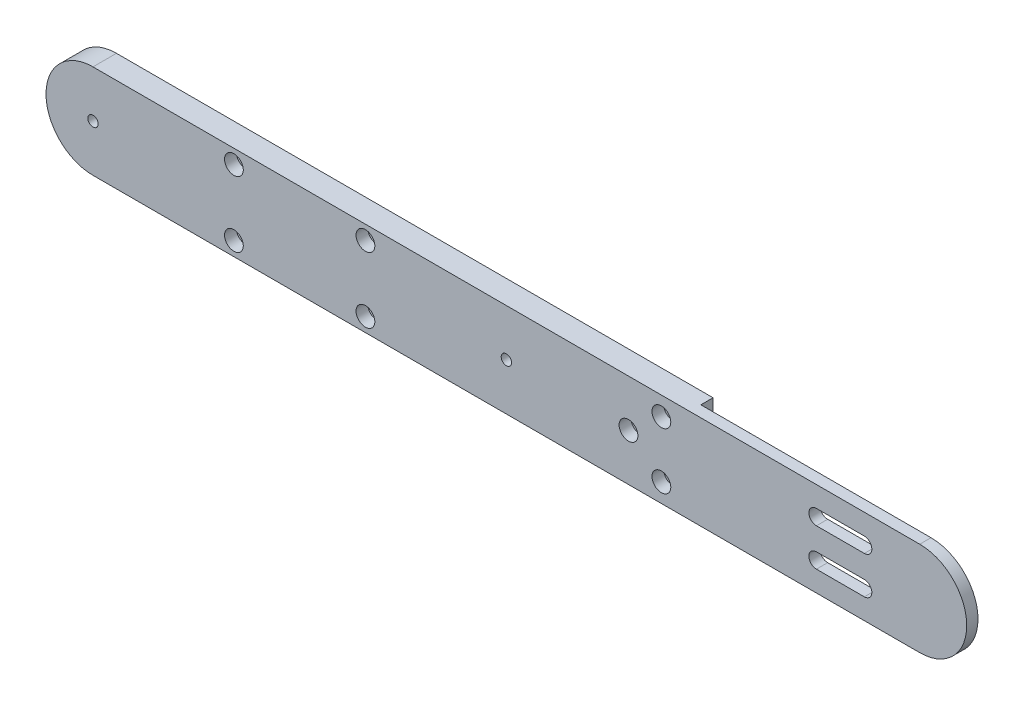
ISO-10303-21;
HEADER;
FILE_DESCRIPTION(('STEP AP214'),'2;1');
FILE_NAME('part.step','',(''),(''),'','','');
FILE_SCHEMA(('AUTOMOTIVE_DESIGN { 1 0 10303 214 1 1 1 1 }'));
ENDSEC;
DATA;
#1=APPLICATION_CONTEXT('core data for automotive mechanical design processes');
#2=APPLICATION_PROTOCOL_DEFINITION('international standard','automotive_design',2000,#1);
#3=PRODUCT_CONTEXT('',#1,'mechanical');
#4=PRODUCT('Part','Part','',(#3));
#5=PRODUCT_RELATED_PRODUCT_CATEGORY('part','',(#4));
#6=PRODUCT_DEFINITION_FORMATION('','',#4);
#7=PRODUCT_DEFINITION_CONTEXT('part definition',#1,'design');
#8=PRODUCT_DEFINITION('design','',#6,#7);
#9=PRODUCT_DEFINITION_SHAPE('','',#8);
#10=(LENGTH_UNIT() NAMED_UNIT(*) SI_UNIT(.MILLI.,.METRE.));
#11=(NAMED_UNIT(*) PLANE_ANGLE_UNIT() SI_UNIT($,.RADIAN.));
#12=(NAMED_UNIT(*) SI_UNIT($,.STERADIAN.) SOLID_ANGLE_UNIT());
#13=UNCERTAINTY_MEASURE_WITH_UNIT(LENGTH_MEASURE(1.E-05),#10,'distance_accuracy_value','');
#14=(GEOMETRIC_REPRESENTATION_CONTEXT(3) GLOBAL_UNCERTAINTY_ASSIGNED_CONTEXT((#13)) GLOBAL_UNIT_ASSIGNED_CONTEXT((#10,
#11,#12)) REPRESENTATION_CONTEXT('',''));
#15=CARTESIAN_POINT('',(0.,0.,0.));
#16=DIRECTION('',(0.,0.,1.));
#17=DIRECTION('',(1.,0.,0.));
#18=AXIS2_PLACEMENT_3D('',#15,#16,#17);
#19=CARTESIAN_POINT('',(121.,6.,5.));
#20=DIRECTION('',(0.,0.,-1.));
#21=DIRECTION('',(-1.,0.,0.));
#22=AXIS2_PLACEMENT_3D('',#19,#20,#21);
#23=CYLINDRICAL_SURFACE('',#22,1.25);
#24=CARTESIAN_POINT('',(121.,6.,0.));
#25=DIRECTION('',(0.,0.,-1.));
#26=DIRECTION('',(-1.,0.,0.));
#27=AXIS2_PLACEMENT_3D('',#24,#25,#26);
#28=CIRCLE('',#27,1.25);
#29=CARTESIAN_POINT('',(119.75,6.,0.));
#30=VERTEX_POINT('',#29);
#31=EDGE_CURVE('E345',#30,#30,#28,.T.);
#32=ORIENTED_EDGE('',*,*,#31,.T.);
#33=EDGE_LOOP('',(#32));
#34=FACE_BOUND('',#33,.T.);
#35=CARTESIAN_POINT('',(121.,6.,2.5));
#36=DIRECTION('',(0.,0.,1.));
#37=DIRECTION('',(1.,0.,0.));
#38=AXIS2_PLACEMENT_3D('',#35,#36,#37);
#39=CIRCLE('',#38,1.25);
#40=CARTESIAN_POINT('',(122.25,6.,2.5));
#41=VERTEX_POINT('',#40);
#42=EDGE_CURVE('E361',#41,#41,#39,.F.);
#43=ORIENTED_EDGE('',*,*,#42,.F.);
#44=EDGE_LOOP('',(#43));
#45=FACE_BOUND('',#44,.T.);
#46=ADVANCED_FACE('F130',(#34,#45),#23,.F.);
#47=CARTESIAN_POINT('',(121.,-6.,5.));
#48=DIRECTION('',(0.,0.,-1.));
#49=DIRECTION('',(-1.,0.,0.));
#50=AXIS2_PLACEMENT_3D('',#47,#48,#49);
#51=CYLINDRICAL_SURFACE('',#50,1.25);
#52=CARTESIAN_POINT('',(121.,-6.,0.));
#53=DIRECTION('',(0.,0.,-1.));
#54=DIRECTION('',(-1.,0.,0.));
#55=AXIS2_PLACEMENT_3D('',#52,#53,#54);
#56=CIRCLE('',#55,1.25);
#57=CARTESIAN_POINT('',(119.75,-6.,0.));
#58=VERTEX_POINT('',#57);
#59=EDGE_CURVE('E342',#58,#58,#56,.T.);
#60=ORIENTED_EDGE('',*,*,#59,.T.);
#61=EDGE_LOOP('',(#60));
#62=FACE_BOUND('',#61,.T.);
#63=CARTESIAN_POINT('',(121.,-6.,2.5));
#64=DIRECTION('',(0.,0.,1.));
#65=DIRECTION('',(1.,0.,0.));
#66=AXIS2_PLACEMENT_3D('',#63,#64,#65);
#67=CIRCLE('',#66,1.25);
#68=CARTESIAN_POINT('',(122.25,-6.,2.5));
#69=VERTEX_POINT('',#68);
#70=EDGE_CURVE('E434',#69,#69,#67,.F.);
#71=ORIENTED_EDGE('',*,*,#70,.F.);
#72=EDGE_LOOP('',(#71));
#73=FACE_BOUND('',#72,.T.);
#74=ADVANCED_FACE('F469',(#62,#73),#51,.F.);
#75=CARTESIAN_POINT('',(114.,0.,5.));
#76=DIRECTION('',(0.,0.,-1.));
#77=DIRECTION('',(-1.,0.,0.));
#78=AXIS2_PLACEMENT_3D('',#75,#76,#77);
#79=CYLINDRICAL_SURFACE('',#78,1.25);
#80=CARTESIAN_POINT('',(114.,0.,0.));
#81=DIRECTION('',(0.,0.,-1.));
#82=DIRECTION('',(-1.,0.,0.));
#83=AXIS2_PLACEMENT_3D('',#80,#81,#82);
#84=CIRCLE('',#83,1.25);
#85=CARTESIAN_POINT('',(112.75,0.,0.));
#86=VERTEX_POINT('',#85);
#87=EDGE_CURVE('E346',#86,#86,#84,.T.);
#88=ORIENTED_EDGE('',*,*,#87,.T.);
#89=EDGE_LOOP('',(#88));
#90=FACE_BOUND('',#89,.T.);
#91=CARTESIAN_POINT('',(114.,0.,2.5));
#92=DIRECTION('',(0.,0.,1.));
#93=DIRECTION('',(1.,0.,0.));
#94=AXIS2_PLACEMENT_3D('',#91,#92,#93);
#95=CIRCLE('',#94,1.25);
#96=CARTESIAN_POINT('',(115.25,0.,2.5));
#97=VERTEX_POINT('',#96);
#98=EDGE_CURVE('E431',#97,#97,#95,.F.);
#99=ORIENTED_EDGE('',*,*,#98,.F.);
#100=EDGE_LOOP('',(#99));
#101=FACE_BOUND('',#100,.T.);
#102=ADVANCED_FACE('F476',(#90,#101),#79,.F.);
#103=CARTESIAN_POINT('',(58.,-7.,5.));
#104=DIRECTION('',(0.,0.,-1.));
#105=DIRECTION('',(-1.,0.,0.));
#106=AXIS2_PLACEMENT_3D('',#103,#104,#105);
#107=CYLINDRICAL_SURFACE('',#106,1.25);
#108=CARTESIAN_POINT('',(58.,-7.,0.));
#109=DIRECTION('',(0.,0.,-1.));
#110=DIRECTION('',(-1.,0.,0.));
#111=AXIS2_PLACEMENT_3D('',#108,#109,#110);
#112=CIRCLE('',#111,1.25);
#113=CARTESIAN_POINT('',(56.75,-7.,0.));
#114=VERTEX_POINT('',#113);
#115=EDGE_CURVE('E349',#114,#114,#112,.T.);
#116=ORIENTED_EDGE('',*,*,#115,.T.);
#117=EDGE_LOOP('',(#116));
#118=FACE_BOUND('',#117,.T.);
#119=CARTESIAN_POINT('',(58.,-7.,2.5));
#120=DIRECTION('',(0.,0.,1.));
#121=DIRECTION('',(1.,0.,0.));
#122=AXIS2_PLACEMENT_3D('',#119,#120,#121);
#123=CIRCLE('',#122,1.25);
#124=CARTESIAN_POINT('',(59.25,-7.,2.5));
#125=VERTEX_POINT('',#124);
#126=EDGE_CURVE('E428',#125,#125,#123,.F.);
#127=ORIENTED_EDGE('',*,*,#126,.F.);
#128=EDGE_LOOP('',(#127));
#129=FACE_BOUND('',#128,.T.);
#130=ADVANCED_FACE('F614',(#118,#129),#107,.F.);
#131=CARTESIAN_POINT('',(30.,-7.,5.));
#132=DIRECTION('',(0.,0.,-1.));
#133=DIRECTION('',(-1.,0.,0.));
#134=AXIS2_PLACEMENT_3D('',#131,#132,#133);
#135=CYLINDRICAL_SURFACE('',#134,1.25);
#136=CARTESIAN_POINT('',(30.,-7.,0.));
#137=DIRECTION('',(0.,0.,-1.));
#138=DIRECTION('',(-1.,0.,0.));
#139=AXIS2_PLACEMENT_3D('',#136,#137,#138);
#140=CIRCLE('',#139,1.25);
#141=CARTESIAN_POINT('',(28.75,-7.,0.));
#142=VERTEX_POINT('',#141);
#143=EDGE_CURVE('E352',#142,#142,#140,.T.);
#144=ORIENTED_EDGE('',*,*,#143,.T.);
#145=EDGE_LOOP('',(#144));
#146=FACE_BOUND('',#145,.T.);
#147=CARTESIAN_POINT('',(30.,-7.,2.5));
#148=DIRECTION('',(0.,0.,1.));
#149=DIRECTION('',(1.,0.,0.));
#150=AXIS2_PLACEMENT_3D('',#147,#148,#149);
#151=CIRCLE('',#150,1.25);
#152=CARTESIAN_POINT('',(31.25,-7.,2.5));
#153=VERTEX_POINT('',#152);
#154=EDGE_CURVE('E425',#153,#153,#151,.F.);
#155=ORIENTED_EDGE('',*,*,#154,.F.);
#156=EDGE_LOOP('',(#155));
#157=FACE_BOUND('',#156,.T.);
#158=ADVANCED_FACE('F618',(#146,#157),#135,.F.);
#159=CARTESIAN_POINT('',(30.,7.,5.));
#160=DIRECTION('',(0.,0.,-1.));
#161=DIRECTION('',(-1.,0.,0.));
#162=AXIS2_PLACEMENT_3D('',#159,#160,#161);
#163=CYLINDRICAL_SURFACE('',#162,1.25);
#164=CARTESIAN_POINT('',(30.,7.,0.));
#165=DIRECTION('',(0.,0.,-1.));
#166=DIRECTION('',(-1.,0.,0.));
#167=AXIS2_PLACEMENT_3D('',#164,#165,#166);
#168=CIRCLE('',#167,1.25);
#169=CARTESIAN_POINT('',(28.75,7.,0.));
#170=VERTEX_POINT('',#169);
#171=EDGE_CURVE('E355',#170,#170,#168,.T.);
#172=ORIENTED_EDGE('',*,*,#171,.T.);
#173=EDGE_LOOP('',(#172));
#174=FACE_BOUND('',#173,.T.);
#175=CARTESIAN_POINT('',(30.,7.,2.5));
#176=DIRECTION('',(0.,0.,1.));
#177=DIRECTION('',(1.,0.,0.));
#178=AXIS2_PLACEMENT_3D('',#175,#176,#177);
#179=CIRCLE('',#178,1.25);
#180=CARTESIAN_POINT('',(31.25,7.,2.5));
#181=VERTEX_POINT('',#180);
#182=EDGE_CURVE('E422',#181,#181,#179,.F.);
#183=ORIENTED_EDGE('',*,*,#182,.F.);
#184=EDGE_LOOP('',(#183));
#185=FACE_BOUND('',#184,.T.);
#186=ADVANCED_FACE('F621',(#174,#185),#163,.F.);
#187=CARTESIAN_POINT('',(58.,7.,5.));
#188=DIRECTION('',(0.,0.,-1.));
#189=DIRECTION('',(-1.,0.,0.));
#190=AXIS2_PLACEMENT_3D('',#187,#188,#189);
#191=CYLINDRICAL_SURFACE('',#190,1.25);
#192=CARTESIAN_POINT('',(58.,7.,0.));
#193=DIRECTION('',(0.,0.,-1.));
#194=DIRECTION('',(-1.,0.,0.));
#195=AXIS2_PLACEMENT_3D('',#192,#193,#194);
#196=CIRCLE('',#195,1.25);
#197=CARTESIAN_POINT('',(56.75,7.,0.));
#198=VERTEX_POINT('',#197);
#199=EDGE_CURVE('E358',#198,#198,#196,.T.);
#200=ORIENTED_EDGE('',*,*,#199,.T.);
#201=EDGE_LOOP('',(#200));
#202=FACE_BOUND('',#201,.T.);
#203=CARTESIAN_POINT('',(58.,7.,2.5));
#204=DIRECTION('',(0.,0.,1.));
#205=DIRECTION('',(1.,0.,0.));
#206=AXIS2_PLACEMENT_3D('',#203,#204,#205);
#207=CIRCLE('',#206,1.25);
#208=CARTESIAN_POINT('',(59.25,7.,2.5));
#209=VERTEX_POINT('',#208);
#210=EDGE_CURVE('E341',#209,#209,#207,.F.);
#211=ORIENTED_EDGE('',*,*,#210,.F.);
#212=EDGE_LOOP('',(#211));
#213=FACE_BOUND('',#212,.T.);
#214=ADVANCED_FACE('F482',(#202,#213),#191,.F.);
#215=CARTESIAN_POINT('',(0.,0.,5.));
#216=DIRECTION('',(0.,0.,-1.));
#217=DIRECTION('',(-1.,0.,0.));
#218=AXIS2_PLACEMENT_3D('',#215,#216,#217);
#219=CYLINDRICAL_SURFACE('',#218,10.);
#220=DIRECTION('',(0.,0.,-1.));
#221=VECTOR('',#220,1.);
#222=CARTESIAN_POINT('',(0.,10.,5.));
#223=LINE('',#222,#221);
#224=CARTESIAN_POINT('',(0.,10.,0.));
#225=VERTEX_POINT('',#224);
#226=CARTESIAN_POINT('',(0.,10.,5.));
#227=VERTEX_POINT('',#226);
#228=EDGE_CURVE('E394',#225,#227,#223,.F.);
#229=ORIENTED_EDGE('',*,*,#228,.F.);
#230=CARTESIAN_POINT('',(0.,0.,0.));
#231=DIRECTION('',(0.,0.,1.));
#232=DIRECTION('',(1.,0.,0.));
#233=AXIS2_PLACEMENT_3D('',#230,#231,#232);
#234=CIRCLE('',#233,10.);
#235=CARTESIAN_POINT('',(0.,-10.,0.));
#236=VERTEX_POINT('',#235);
#237=EDGE_CURVE('E389',#225,#236,#234,.T.);
#238=ORIENTED_EDGE('',*,*,#237,.T.);
#239=DIRECTION('',(0.,0.,-1.));
#240=VECTOR('',#239,1.);
#241=CARTESIAN_POINT('',(0.,-10.,5.));
#242=LINE('',#241,#240);
#243=CARTESIAN_POINT('',(0.,-10.,5.));
#244=VERTEX_POINT('',#243);
#245=EDGE_CURVE('E388',#244,#236,#242,.T.);
#246=ORIENTED_EDGE('',*,*,#245,.F.);
#247=CARTESIAN_POINT('',(0.,0.,5.));
#248=DIRECTION('',(0.,0.,1.));
#249=DIRECTION('',(1.,0.,0.));
#250=AXIS2_PLACEMENT_3D('',#247,#248,#249);
#251=CIRCLE('',#250,10.);
#252=EDGE_CURVE('E385',#227,#244,#251,.T.);
#253=ORIENTED_EDGE('',*,*,#252,.F.);
#254=EDGE_LOOP('',(#229,#238,#246,#253));
#255=FACE_BOUND('',#254,.T.);
#256=ADVANCED_FACE('F515',(#255),#219,.T.);
#257=CARTESIAN_POINT('',(0.,0.,0.));
#258=DIRECTION('',(0.,0.,1.));
#259=DIRECTION('',(1.,0.,0.));
#260=AXIS2_PLACEMENT_3D('',#257,#258,#259);
#261=PLANE('',#260);
#262=ORIENTED_EDGE('',*,*,#199,.F.);
#263=EDGE_LOOP('',(#262));
#264=FACE_BOUND('',#263,.T.);
#265=ORIENTED_EDGE('',*,*,#171,.F.);
#266=EDGE_LOOP('',(#265));
#267=FACE_BOUND('',#266,.T.);
#268=ORIENTED_EDGE('',*,*,#143,.F.);
#269=EDGE_LOOP('',(#268));
#270=FACE_BOUND('',#269,.T.);
#271=ORIENTED_EDGE('',*,*,#115,.F.);
#272=EDGE_LOOP('',(#271));
#273=FACE_BOUND('',#272,.T.);
#274=ORIENTED_EDGE('',*,*,#87,.F.);
#275=EDGE_LOOP('',(#274));
#276=FACE_BOUND('',#275,.T.);
#277=ORIENTED_EDGE('',*,*,#59,.F.);
#278=EDGE_LOOP('',(#277));
#279=FACE_BOUND('',#278,.T.);
#280=ORIENTED_EDGE('',*,*,#31,.F.);
#281=EDGE_LOOP('',(#280));
#282=FACE_BOUND('',#281,.T.);
#283=CARTESIAN_POINT('',(88.,0.,0.));
#284=DIRECTION('',(0.,0.,1.));
#285=DIRECTION('',(1.,0.,0.));
#286=AXIS2_PLACEMENT_3D('',#283,#284,#285);
#287=CIRCLE('',#286,2.54999999999999);
#288=CARTESIAN_POINT('',(90.55,0.,0.));
#289=VERTEX_POINT('',#288);
#290=EDGE_CURVE('E369',#289,#289,#287,.T.);
#291=ORIENTED_EDGE('',*,*,#290,.T.);
#292=EDGE_LOOP('',(#291));
#293=FACE_BOUND('',#292,.T.);
#294=CARTESIAN_POINT('',(0.,0.,0.));
#295=DIRECTION('',(0.,0.,1.));
#296=DIRECTION('',(1.,0.,0.));
#297=AXIS2_PLACEMENT_3D('',#294,#295,#296);
#298=CIRCLE('',#297,2.55);
#299=CARTESIAN_POINT('',(2.55,0.,0.));
#300=VERTEX_POINT('',#299);
#301=EDGE_CURVE('E372',#300,#300,#298,.T.);
#302=ORIENTED_EDGE('',*,*,#301,.T.);
#303=EDGE_LOOP('',(#302));
#304=FACE_BOUND('',#303,.T.);
#305=DIRECTION('',(1.,0.,0.));
#306=VECTOR('',#305,1.);
#307=CARTESIAN_POINT('',(0.,10.,0.));
#308=LINE('',#307,#306);
#309=CARTESIAN_POINT('',(127.,10.,0.));
#310=VERTEX_POINT('',#309);
#311=EDGE_CURVE('E401',#225,#310,#308,.T.);
#312=ORIENTED_EDGE('',*,*,#311,.T.);
#313=DIRECTION('',(0.,1.,0.));
#314=VECTOR('',#313,1.);
#315=CARTESIAN_POINT('',(127.,-10.,0.));
#316=LINE('',#315,#314);
#317=CARTESIAN_POINT('',(127.,-10.,0.));
#318=VERTEX_POINT('',#317);
#319=EDGE_CURVE('E294',#318,#310,#316,.T.);
#320=ORIENTED_EDGE('',*,*,#319,.F.);
#321=DIRECTION('',(1.,0.,0.));
#322=VECTOR('',#321,1.);
#323=CARTESIAN_POINT('',(0.,-10.,0.));
#324=LINE('',#323,#322);
#325=EDGE_CURVE('E405',#236,#318,#324,.T.);
#326=ORIENTED_EDGE('',*,*,#325,.F.);
#327=ORIENTED_EDGE('',*,*,#237,.F.);
#328=EDGE_LOOP('',(#312,#320,#326,#327));
#329=FACE_BOUND('',#328,.T.);
#330=ADVANCED_FACE('F511',(#264,#267,#270,#273,#276,#279,#282,#293,#304,#329),#261,.F.);
#331=CARTESIAN_POINT('',(0.,0.,5.));
#332=DIRECTION('',(0.,0.,1.));
#333=DIRECTION('',(1.,0.,0.));
#334=AXIS2_PLACEMENT_3D('',#331,#332,#333);
#335=PLANE('',#334);
#336=CARTESIAN_POINT('',(154.,-4.,5.));
#337=DIRECTION('',(0.,0.,1.));
#338=DIRECTION('',(1.,0.,0.));
#339=AXIS2_PLACEMENT_3D('',#336,#337,#338);
#340=CIRCLE('',#339,1.59999999999999);
#341=CARTESIAN_POINT('',(154.,-2.4,5.));
#342=VERTEX_POINT('',#341);
#343=CARTESIAN_POINT('',(154.,-5.6,5.));
#344=VERTEX_POINT('',#343);
#345=EDGE_CURVE('E241',#342,#344,#340,.T.);
#346=ORIENTED_EDGE('',*,*,#345,.F.);
#347=DIRECTION('',(-1.,0.,0.));
#348=VECTOR('',#347,1.);
#349=CARTESIAN_POINT('',(164.2,-2.4,5.));
#350=LINE('',#349,#348);
#351=CARTESIAN_POINT('',(164.2,-2.4,5.));
#352=VERTEX_POINT('',#351);
#353=EDGE_CURVE('E253',#352,#342,#350,.T.);
#354=ORIENTED_EDGE('',*,*,#353,.F.);
#355=CARTESIAN_POINT('',(164.2,-4.,5.));
#356=DIRECTION('',(0.,0.,1.));
#357=DIRECTION('',(1.,0.,0.));
#358=AXIS2_PLACEMENT_3D('',#355,#356,#357);
#359=CIRCLE('',#358,1.59999999999999);
#360=CARTESIAN_POINT('',(164.2,-5.59999999999999,5.));
#361=VERTEX_POINT('',#360);
#362=EDGE_CURVE('E247',#361,#352,#359,.T.);
#363=ORIENTED_EDGE('',*,*,#362,.F.);
#364=DIRECTION('',(-1.,0.,0.));
#365=VECTOR('',#364,1.);
#366=CARTESIAN_POINT('',(164.2,-5.6,5.));
#367=LINE('',#366,#365);
#368=EDGE_CURVE('E145',#361,#344,#367,.T.);
#369=ORIENTED_EDGE('',*,*,#368,.T.);
#370=EDGE_LOOP('',(#346,#354,#363,#369));
#371=FACE_BOUND('',#370,.T.);
#372=DIRECTION('',(-1.,0.,0.));
#373=VECTOR('',#372,1.);
#374=CARTESIAN_POINT('',(164.2,5.6,5.));
#375=LINE('',#374,#373);
#376=CARTESIAN_POINT('',(164.2,5.6,5.));
#377=VERTEX_POINT('',#376);
#378=CARTESIAN_POINT('',(154.,5.59999999999999,5.));
#379=VERTEX_POINT('',#378);
#380=EDGE_CURVE('E271',#377,#379,#375,.T.);
#381=ORIENTED_EDGE('',*,*,#380,.F.);
#382=CARTESIAN_POINT('',(164.2,4.,5.));
#383=DIRECTION('',(0.,0.,1.));
#384=DIRECTION('',(1.,0.,0.));
#385=AXIS2_PLACEMENT_3D('',#382,#383,#384);
#386=CIRCLE('',#385,1.59999999999999);
#387=CARTESIAN_POINT('',(164.2,2.4,5.));
#388=VERTEX_POINT('',#387);
#389=EDGE_CURVE('E263',#388,#377,#386,.T.);
#390=ORIENTED_EDGE('',*,*,#389,.F.);
#391=DIRECTION('',(-1.,0.,0.));
#392=VECTOR('',#391,1.);
#393=CARTESIAN_POINT('',(164.2,2.4,5.));
#394=LINE('',#393,#392);
#395=CARTESIAN_POINT('',(154.,2.4,5.));
#396=VERTEX_POINT('',#395);
#397=EDGE_CURVE('E266',#388,#396,#394,.T.);
#398=ORIENTED_EDGE('',*,*,#397,.T.);
#399=CARTESIAN_POINT('',(154.,4.,5.));
#400=DIRECTION('',(0.,0.,1.));
#401=DIRECTION('',(1.,0.,0.));
#402=AXIS2_PLACEMENT_3D('',#399,#400,#401);
#403=CIRCLE('',#402,1.59999999999999);
#404=EDGE_CURVE('E153',#379,#396,#403,.T.);
#405=ORIENTED_EDGE('',*,*,#404,.F.);
#406=EDGE_LOOP('',(#381,#390,#398,#405));
#407=FACE_BOUND('',#406,.T.);
#408=CARTESIAN_POINT('',(121.,-6.,5.));
#409=DIRECTION('',(0.,0.,1.));
#410=DIRECTION('',(1.,0.,0.));
#411=AXIS2_PLACEMENT_3D('',#408,#409,#410);
#412=CIRCLE('',#411,2.);
#413=CARTESIAN_POINT('',(123.,-6.,5.));
#414=VERTEX_POINT('',#413);
#415=EDGE_CURVE('E315',#414,#414,#412,.T.);
#416=ORIENTED_EDGE('',*,*,#415,.F.);
#417=EDGE_LOOP('',(#416));
#418=FACE_BOUND('',#417,.T.);
#419=CARTESIAN_POINT('',(114.,0.,5.));
#420=DIRECTION('',(0.,0.,1.));
#421=DIRECTION('',(1.,0.,0.));
#422=AXIS2_PLACEMENT_3D('',#419,#420,#421);
#423=CIRCLE('',#422,2.);
#424=CARTESIAN_POINT('',(116.,0.,5.));
#425=VERTEX_POINT('',#424);
#426=EDGE_CURVE('E316',#425,#425,#423,.T.);
#427=ORIENTED_EDGE('',*,*,#426,.F.);
#428=EDGE_LOOP('',(#427));
#429=FACE_BOUND('',#428,.T.);
#430=CARTESIAN_POINT('',(58.,7.,5.));
#431=DIRECTION('',(0.,0.,1.));
#432=DIRECTION('',(1.,0.,0.));
#433=AXIS2_PLACEMENT_3D('',#430,#431,#432);
#434=CIRCLE('',#433,2.);
#435=CARTESIAN_POINT('',(60.,7.,5.));
#436=VERTEX_POINT('',#435);
#437=EDGE_CURVE('E323',#436,#436,#434,.T.);
#438=ORIENTED_EDGE('',*,*,#437,.F.);
#439=EDGE_LOOP('',(#438));
#440=FACE_BOUND('',#439,.T.);
#441=CARTESIAN_POINT('',(30.,7.,5.));
#442=DIRECTION('',(0.,0.,1.));
#443=DIRECTION('',(1.,0.,0.));
#444=AXIS2_PLACEMENT_3D('',#441,#442,#443);
#445=CIRCLE('',#444,2.);
#446=CARTESIAN_POINT('',(32.,7.,5.));
#447=VERTEX_POINT('',#446);
#448=EDGE_CURVE('E329',#447,#447,#445,.T.);
#449=ORIENTED_EDGE('',*,*,#448,.F.);
#450=EDGE_LOOP('',(#449));
#451=FACE_BOUND('',#450,.T.);
#452=CARTESIAN_POINT('',(30.,-7.,5.));
#453=DIRECTION('',(0.,0.,1.));
#454=DIRECTION('',(1.,0.,0.));
#455=AXIS2_PLACEMENT_3D('',#452,#453,#454);
#456=CIRCLE('',#455,2.);
#457=CARTESIAN_POINT('',(32.,-7.,5.));
#458=VERTEX_POINT('',#457);
#459=EDGE_CURVE('E303',#458,#458,#456,.T.);
#460=ORIENTED_EDGE('',*,*,#459,.F.);
#461=EDGE_LOOP('',(#460));
#462=FACE_BOUND('',#461,.T.);
#463=CARTESIAN_POINT('',(58.,-7.,5.));
#464=DIRECTION('',(0.,0.,1.));
#465=DIRECTION('',(1.,0.,0.));
#466=AXIS2_PLACEMENT_3D('',#463,#464,#465);
#467=CIRCLE('',#466,2.);
#468=CARTESIAN_POINT('',(60.,-7.,5.));
#469=VERTEX_POINT('',#468);
#470=EDGE_CURVE('E304',#469,#469,#467,.T.);
#471=ORIENTED_EDGE('',*,*,#470,.F.);
#472=EDGE_LOOP('',(#471));
#473=FACE_BOUND('',#472,.T.);
#474=CARTESIAN_POINT('',(121.,6.,5.));
#475=DIRECTION('',(0.,0.,1.));
#476=DIRECTION('',(1.,0.,0.));
#477=AXIS2_PLACEMENT_3D('',#474,#475,#476);
#478=CIRCLE('',#477,2.);
#479=CARTESIAN_POINT('',(123.,6.,5.));
#480=VERTEX_POINT('',#479);
#481=EDGE_CURVE('E319',#480,#480,#478,.T.);
#482=ORIENTED_EDGE('',*,*,#481,.F.);
#483=EDGE_LOOP('',(#482));
#484=FACE_BOUND('',#483,.T.);
#485=CARTESIAN_POINT('',(0.,0.,5.));
#486=DIRECTION('',(0.,0.,1.));
#487=DIRECTION('',(1.,0.,0.));
#488=AXIS2_PLACEMENT_3D('',#485,#486,#487);
#489=CIRCLE('',#488,1.1);
#490=CARTESIAN_POINT('',(1.1,0.,5.));
#491=VERTEX_POINT('',#490);
#492=EDGE_CURVE('E377',#491,#491,#489,.T.);
#493=ORIENTED_EDGE('',*,*,#492,.F.);
#494=EDGE_LOOP('',(#493));
#495=FACE_BOUND('',#494,.T.);
#496=CARTESIAN_POINT('',(88.,0.,5.));
#497=DIRECTION('',(0.,0.,1.));
#498=DIRECTION('',(1.,0.,0.));
#499=AXIS2_PLACEMENT_3D('',#496,#497,#498);
#500=CIRCLE('',#499,1.09999999999999);
#501=CARTESIAN_POINT('',(89.1,0.,5.));
#502=VERTEX_POINT('',#501);
#503=EDGE_CURVE('E381',#502,#502,#500,.T.);
#504=ORIENTED_EDGE('',*,*,#503,.F.);
#505=EDGE_LOOP('',(#504));
#506=FACE_BOUND('',#505,.T.);
#507=ORIENTED_EDGE('',*,*,#252,.T.);
#508=DIRECTION('',(1.,0.,0.));
#509=VECTOR('',#508,1.);
#510=CARTESIAN_POINT('',(0.,-10.,5.));
#511=LINE('',#510,#509);
#512=CARTESIAN_POINT('',(176.,-10.,5.));
#513=VERTEX_POINT('',#512);
#514=EDGE_CURVE('E397',#244,#513,#511,.T.);
#515=ORIENTED_EDGE('',*,*,#514,.T.);
#516=CARTESIAN_POINT('',(176.,0.,5.));
#517=DIRECTION('',(0.,0.,1.));
#518=DIRECTION('',(1.,0.,0.));
#519=AXIS2_PLACEMENT_3D('',#516,#517,#518);
#520=CIRCLE('',#519,10.);
#521=CARTESIAN_POINT('',(176.,10.,5.));
#522=VERTEX_POINT('',#521);
#523=EDGE_CURVE('E380',#513,#522,#520,.T.);
#524=ORIENTED_EDGE('',*,*,#523,.T.);
#525=DIRECTION('',(1.,0.,0.));
#526=VECTOR('',#525,1.);
#527=CARTESIAN_POINT('',(0.,10.,5.));
#528=LINE('',#527,#526);
#529=EDGE_CURVE('E400',#227,#522,#528,.T.);
#530=ORIENTED_EDGE('',*,*,#529,.F.);
#531=EDGE_LOOP('',(#507,#515,#524,#530));
#532=FACE_BOUND('',#531,.T.);
#533=ADVANCED_FACE('F250',(#371,#407,#418,#429,#440,#451,#462,#473,#484,#495,#506,#532),#335,.T.);
#534=CARTESIAN_POINT('',(176.,0.,5.));
#535=DIRECTION('',(0.,0.,-1.));
#536=DIRECTION('',(-1.,0.,0.));
#537=AXIS2_PLACEMENT_3D('',#534,#535,#536);
#538=CYLINDRICAL_SURFACE('',#537,10.);
#539=CARTESIAN_POINT('',(176.,0.,2.6));
#540=DIRECTION('',(0.,0.,1.));
#541=DIRECTION('',(1.,0.,0.));
#542=AXIS2_PLACEMENT_3D('',#539,#540,#541);
#543=CIRCLE('',#542,10.);
#544=CARTESIAN_POINT('',(176.,-10.,2.6));
#545=VERTEX_POINT('',#544);
#546=CARTESIAN_POINT('',(176.,10.,2.6));
#547=VERTEX_POINT('',#546);
#548=EDGE_CURVE('E296',#545,#547,#543,.T.);
#549=ORIENTED_EDGE('',*,*,#548,.T.);
#550=DIRECTION('',(0.,0.,-1.));
#551=VECTOR('',#550,1.);
#552=CARTESIAN_POINT('',(176.,10.,5.));
#553=LINE('',#552,#551);
#554=EDGE_CURVE('E404',#522,#547,#553,.T.);
#555=ORIENTED_EDGE('',*,*,#554,.F.);
#556=ORIENTED_EDGE('',*,*,#523,.F.);
#557=DIRECTION('',(0.,0.,-1.));
#558=VECTOR('',#557,1.);
#559=CARTESIAN_POINT('',(176.,-10.,5.));
#560=LINE('',#559,#558);
#561=EDGE_CURVE('E392',#513,#545,#560,.T.);
#562=ORIENTED_EDGE('',*,*,#561,.T.);
#563=EDGE_LOOP('',(#549,#555,#556,#562));
#564=FACE_BOUND('',#563,.T.);
#565=ADVANCED_FACE('F132',(#564),#538,.T.);
#566=CARTESIAN_POINT('',(0.,10.,5.));
#567=DIRECTION('',(0.,1.,0.));
#568=DIRECTION('',(0.,0.,1.));
#569=AXIS2_PLACEMENT_3D('',#566,#567,#568);
#570=PLANE('',#569);
#571=DIRECTION('',(0.,0.,1.));
#572=VECTOR('',#571,1.);
#573=CARTESIAN_POINT('',(127.,10.,0.));
#574=LINE('',#573,#572);
#575=CARTESIAN_POINT('',(127.,10.,2.6));
#576=VERTEX_POINT('',#575);
#577=EDGE_CURVE('E260',#310,#576,#574,.T.);
#578=ORIENTED_EDGE('',*,*,#577,.F.);
#579=ORIENTED_EDGE('',*,*,#311,.F.);
#580=ORIENTED_EDGE('',*,*,#228,.T.);
#581=ORIENTED_EDGE('',*,*,#529,.T.);
#582=ORIENTED_EDGE('',*,*,#554,.T.);
#583=DIRECTION('',(1.,0.,0.));
#584=VECTOR('',#583,1.);
#585=CARTESIAN_POINT('',(127.,10.,2.6));
#586=LINE('',#585,#584);
#587=EDGE_CURVE('E286',#576,#547,#586,.T.);
#588=ORIENTED_EDGE('',*,*,#587,.F.);
#589=EDGE_LOOP('',(#578,#579,#580,#581,#582,#588));
#590=FACE_BOUND('',#589,.T.);
#591=ADVANCED_FACE('F512',(#590),#570,.T.);
#592=CARTESIAN_POINT('',(0.,-10.,5.));
#593=DIRECTION('',(0.,1.,0.));
#594=DIRECTION('',(0.,0.,1.));
#595=AXIS2_PLACEMENT_3D('',#592,#593,#594);
#596=PLANE('',#595);
#597=ORIENTED_EDGE('',*,*,#325,.T.);
#598=DIRECTION('',(0.,0.,1.));
#599=VECTOR('',#598,1.);
#600=CARTESIAN_POINT('',(127.,-10.,0.));
#601=LINE('',#600,#599);
#602=CARTESIAN_POINT('',(127.,-10.,2.6));
#603=VERTEX_POINT('',#602);
#604=EDGE_CURVE('E282',#318,#603,#601,.T.);
#605=ORIENTED_EDGE('',*,*,#604,.T.);
#606=DIRECTION('',(1.,0.,0.));
#607=VECTOR('',#606,1.);
#608=CARTESIAN_POINT('',(127.,-10.,2.6));
#609=LINE('',#608,#607);
#610=EDGE_CURVE('E285',#603,#545,#609,.T.);
#611=ORIENTED_EDGE('',*,*,#610,.T.);
#612=ORIENTED_EDGE('',*,*,#561,.F.);
#613=ORIENTED_EDGE('',*,*,#514,.F.);
#614=ORIENTED_EDGE('',*,*,#245,.T.);
#615=EDGE_LOOP('',(#597,#605,#611,#612,#613,#614));
#616=FACE_BOUND('',#615,.T.);
#617=ADVANCED_FACE('F507',(#616),#596,.F.);
#618=CARTESIAN_POINT('',(88.,0.,5.));
#619=DIRECTION('',(0.,0.,-1.));
#620=DIRECTION('',(-1.,0.,0.));
#621=AXIS2_PLACEMENT_3D('',#618,#619,#620);
#622=CYLINDRICAL_SURFACE('',#621,1.09999999999999);
#623=CARTESIAN_POINT('',(88.,0.,2.6));
#624=DIRECTION('',(0.,0.,1.));
#625=DIRECTION('',(1.,0.,0.));
#626=AXIS2_PLACEMENT_3D('',#623,#624,#625);
#627=CIRCLE('',#626,1.09999999999999);
#628=CARTESIAN_POINT('',(89.1,0.,2.6));
#629=VERTEX_POINT('',#628);
#630=EDGE_CURVE('E384',#629,#629,#627,.T.);
#631=ORIENTED_EDGE('',*,*,#630,.F.);
#632=EDGE_LOOP('',(#631));
#633=FACE_BOUND('',#632,.T.);
#634=ORIENTED_EDGE('',*,*,#503,.T.);
#635=EDGE_LOOP('',(#634));
#636=FACE_BOUND('',#635,.T.);
#637=ADVANCED_FACE('F503',(#633,#636),#622,.F.);
#638=CARTESIAN_POINT('',(0.,0.,5.));
#639=DIRECTION('',(0.,0.,-1.));
#640=DIRECTION('',(-1.,0.,0.));
#641=AXIS2_PLACEMENT_3D('',#638,#639,#640);
#642=CYLINDRICAL_SURFACE('',#641,1.1);
#643=CARTESIAN_POINT('',(0.,0.,2.6));
#644=DIRECTION('',(0.,0.,1.));
#645=DIRECTION('',(1.,0.,0.));
#646=AXIS2_PLACEMENT_3D('',#643,#644,#645);
#647=CIRCLE('',#646,1.1);
#648=CARTESIAN_POINT('',(1.1,0.,2.6));
#649=VERTEX_POINT('',#648);
#650=EDGE_CURVE('E368',#649,#649,#647,.T.);
#651=ORIENTED_EDGE('',*,*,#650,.F.);
#652=EDGE_LOOP('',(#651));
#653=FACE_BOUND('',#652,.T.);
#654=ORIENTED_EDGE('',*,*,#492,.T.);
#655=EDGE_LOOP('',(#654));
#656=FACE_BOUND('',#655,.T.);
#657=ADVANCED_FACE('F496',(#653,#656),#642,.F.);
#658=CARTESIAN_POINT('',(0.,0.,2.6));
#659=DIRECTION('',(0.,0.,-1.));
#660=DIRECTION('',(-1.,0.,0.));
#661=AXIS2_PLACEMENT_3D('',#658,#659,#660);
#662=CYLINDRICAL_SURFACE('',#661,2.55);
#663=CARTESIAN_POINT('',(0.,0.,2.6));
#664=DIRECTION('',(0.,0.,1.));
#665=DIRECTION('',(1.,0.,0.));
#666=AXIS2_PLACEMENT_3D('',#663,#664,#665);
#667=CIRCLE('',#666,2.55);
#668=CARTESIAN_POINT('',(2.55,0.,2.6));
#669=VERTEX_POINT('',#668);
#670=EDGE_CURVE('E364',#669,#669,#667,.T.);
#671=ORIENTED_EDGE('',*,*,#670,.T.);
#672=EDGE_LOOP('',(#671));
#673=FACE_BOUND('',#672,.T.);
#674=ORIENTED_EDGE('',*,*,#301,.F.);
#675=EDGE_LOOP('',(#674));
#676=FACE_BOUND('',#675,.T.);
#677=ADVANCED_FACE('F493',(#673,#676),#662,.F.);
#678=CARTESIAN_POINT('',(0.,0.,2.6));
#679=DIRECTION('',(0.,0.,1.));
#680=DIRECTION('',(1.,0.,0.));
#681=AXIS2_PLACEMENT_3D('',#678,#679,#680);
#682=PLANE('',#681);
#683=ORIENTED_EDGE('',*,*,#650,.T.);
#684=EDGE_LOOP('',(#683));
#685=FACE_BOUND('',#684,.T.);
#686=ORIENTED_EDGE('',*,*,#670,.F.);
#687=EDGE_LOOP('',(#686));
#688=FACE_BOUND('',#687,.T.);
#689=ADVANCED_FACE('F491',(#685,#688),#682,.F.);
#690=CARTESIAN_POINT('',(88.,0.,2.6));
#691=DIRECTION('',(0.,0.,-1.));
#692=DIRECTION('',(-1.,0.,0.));
#693=AXIS2_PLACEMENT_3D('',#690,#691,#692);
#694=CYLINDRICAL_SURFACE('',#693,2.54999999999999);
#695=CARTESIAN_POINT('',(88.,0.,2.6));
#696=DIRECTION('',(0.,0.,1.));
#697=DIRECTION('',(1.,0.,0.));
#698=AXIS2_PLACEMENT_3D('',#695,#696,#697);
#699=CIRCLE('',#698,2.54999999999999);
#700=CARTESIAN_POINT('',(90.55,0.,2.6));
#701=VERTEX_POINT('',#700);
#702=EDGE_CURVE('E365',#701,#701,#699,.T.);
#703=ORIENTED_EDGE('',*,*,#702,.T.);
#704=EDGE_LOOP('',(#703));
#705=FACE_BOUND('',#704,.T.);
#706=ORIENTED_EDGE('',*,*,#290,.F.);
#707=EDGE_LOOP('',(#706));
#708=FACE_BOUND('',#707,.T.);
#709=ADVANCED_FACE('F487',(#705,#708),#694,.F.);
#710=CARTESIAN_POINT('',(88.,0.,2.6));
#711=DIRECTION('',(0.,0.,1.));
#712=DIRECTION('',(1.,0.,0.));
#713=AXIS2_PLACEMENT_3D('',#710,#711,#712);
#714=PLANE('',#713);
#715=ORIENTED_EDGE('',*,*,#630,.T.);
#716=EDGE_LOOP('',(#715));
#717=FACE_BOUND('',#716,.T.);
#718=ORIENTED_EDGE('',*,*,#702,.F.);
#719=EDGE_LOOP('',(#718));
#720=FACE_BOUND('',#719,.T.);
#721=ADVANCED_FACE('F484',(#717,#720),#714,.F.);
#722=CARTESIAN_POINT('',(0.,0.,2.5));
#723=DIRECTION('',(0.,0.,1.));
#724=DIRECTION('',(1.,0.,0.));
#725=AXIS2_PLACEMENT_3D('',#722,#723,#724);
#726=PLANE('',#725);
#727=CARTESIAN_POINT('',(58.,7.,2.5));
#728=DIRECTION('',(0.,0.,1.));
#729=DIRECTION('',(1.,0.,0.));
#730=AXIS2_PLACEMENT_3D('',#727,#728,#729);
#731=CIRCLE('',#730,2.);
#732=CARTESIAN_POINT('',(60.,7.,2.5));
#733=VERTEX_POINT('',#732);
#734=EDGE_CURVE('E326',#733,#733,#731,.F.);
#735=ORIENTED_EDGE('',*,*,#734,.F.);
#736=EDGE_LOOP('',(#735));
#737=FACE_BOUND('',#736,.T.);
#738=ORIENTED_EDGE('',*,*,#210,.T.);
#739=EDGE_LOOP('',(#738));
#740=FACE_BOUND('',#739,.T.);
#741=ADVANCED_FACE('F486',(#737,#740),#726,.T.);
#742=CARTESIAN_POINT('',(58.,7.,-5.65685424949239));
#743=DIRECTION('',(0.,0.,1.));
#744=DIRECTION('',(1.,0.,0.));
#745=AXIS2_PLACEMENT_3D('',#742,#743,#744);
#746=CYLINDRICAL_SURFACE('',#745,2.);
#747=ORIENTED_EDGE('',*,*,#734,.T.);
#748=EDGE_LOOP('',(#747));
#749=FACE_BOUND('',#748,.T.);
#750=ORIENTED_EDGE('',*,*,#437,.T.);
#751=EDGE_LOOP('',(#750));
#752=FACE_BOUND('',#751,.T.);
#753=ADVANCED_FACE('F592',(#749,#752),#746,.F.);
#754=CARTESIAN_POINT('',(0.,0.,2.5));
#755=DIRECTION('',(0.,0.,1.));
#756=DIRECTION('',(1.,0.,0.));
#757=AXIS2_PLACEMENT_3D('',#754,#755,#756);
#758=PLANE('',#757);
#759=CARTESIAN_POINT('',(30.,7.,2.5));
#760=DIRECTION('',(0.,0.,1.));
#761=DIRECTION('',(1.,0.,0.));
#762=AXIS2_PLACEMENT_3D('',#759,#760,#761);
#763=CIRCLE('',#762,2.);
#764=CARTESIAN_POINT('',(32.,7.,2.5));
#765=VERTEX_POINT('',#764);
#766=EDGE_CURVE('E307',#765,#765,#763,.F.);
#767=ORIENTED_EDGE('',*,*,#766,.F.);
#768=EDGE_LOOP('',(#767));
#769=FACE_BOUND('',#768,.T.);
#770=ORIENTED_EDGE('',*,*,#182,.T.);
#771=EDGE_LOOP('',(#770));
#772=FACE_BOUND('',#771,.T.);
#773=ADVANCED_FACE('F595',(#769,#772),#758,.T.);
#774=CARTESIAN_POINT('',(30.,7.,-5.65685424949239));
#775=DIRECTION('',(0.,0.,1.));
#776=DIRECTION('',(1.,0.,0.));
#777=AXIS2_PLACEMENT_3D('',#774,#775,#776);
#778=CYLINDRICAL_SURFACE('',#777,2.);
#779=ORIENTED_EDGE('',*,*,#766,.T.);
#780=EDGE_LOOP('',(#779));
#781=FACE_BOUND('',#780,.T.);
#782=ORIENTED_EDGE('',*,*,#448,.T.);
#783=EDGE_LOOP('',(#782));
#784=FACE_BOUND('',#783,.T.);
#785=ADVANCED_FACE('F566',(#781,#784),#778,.F.);
#786=CARTESIAN_POINT('',(0.,0.,2.5));
#787=DIRECTION('',(0.,0.,1.));
#788=DIRECTION('',(1.,0.,0.));
#789=AXIS2_PLACEMENT_3D('',#786,#787,#788);
#790=PLANE('',#789);
#791=CARTESIAN_POINT('',(30.,-7.,2.5));
#792=DIRECTION('',(0.,0.,1.));
#793=DIRECTION('',(1.,0.,0.));
#794=AXIS2_PLACEMENT_3D('',#791,#792,#793);
#795=CIRCLE('',#794,2.);
#796=CARTESIAN_POINT('',(32.,-7.,2.5));
#797=VERTEX_POINT('',#796);
#798=EDGE_CURVE('E300',#797,#797,#795,.F.);
#799=ORIENTED_EDGE('',*,*,#798,.F.);
#800=EDGE_LOOP('',(#799));
#801=FACE_BOUND('',#800,.T.);
#802=ORIENTED_EDGE('',*,*,#154,.T.);
#803=EDGE_LOOP('',(#802));
#804=FACE_BOUND('',#803,.T.);
#805=ADVANCED_FACE('F562',(#801,#804),#790,.T.);
#806=CARTESIAN_POINT('',(30.,-7.,-5.65685424949239));
#807=DIRECTION('',(0.,0.,1.));
#808=DIRECTION('',(1.,0.,0.));
#809=AXIS2_PLACEMENT_3D('',#806,#807,#808);
#810=CYLINDRICAL_SURFACE('',#809,2.);
#811=ORIENTED_EDGE('',*,*,#798,.T.);
#812=EDGE_LOOP('',(#811));
#813=FACE_BOUND('',#812,.T.);
#814=ORIENTED_EDGE('',*,*,#459,.T.);
#815=EDGE_LOOP('',(#814));
#816=FACE_BOUND('',#815,.T.);
#817=ADVANCED_FACE('F558',(#813,#816),#810,.F.);
#818=CARTESIAN_POINT('',(0.,0.,2.5));
#819=DIRECTION('',(0.,0.,1.));
#820=DIRECTION('',(1.,0.,0.));
#821=AXIS2_PLACEMENT_3D('',#818,#819,#820);
#822=PLANE('',#821);
#823=CARTESIAN_POINT('',(58.,-7.,2.5));
#824=DIRECTION('',(0.,0.,1.));
#825=DIRECTION('',(1.,0.,0.));
#826=AXIS2_PLACEMENT_3D('',#823,#824,#825);
#827=CIRCLE('',#826,2.);
#828=CARTESIAN_POINT('',(60.,-7.,2.5));
#829=VERTEX_POINT('',#828);
#830=EDGE_CURVE('E299',#829,#829,#827,.F.);
#831=ORIENTED_EDGE('',*,*,#830,.F.);
#832=EDGE_LOOP('',(#831));
#833=FACE_BOUND('',#832,.T.);
#834=ORIENTED_EDGE('',*,*,#126,.T.);
#835=EDGE_LOOP('',(#834));
#836=FACE_BOUND('',#835,.T.);
#837=ADVANCED_FACE('F561',(#833,#836),#822,.T.);
#838=CARTESIAN_POINT('',(58.,-7.,-5.65685424949239));
#839=DIRECTION('',(0.,0.,1.));
#840=DIRECTION('',(1.,0.,0.));
#841=AXIS2_PLACEMENT_3D('',#838,#839,#840);
#842=CYLINDRICAL_SURFACE('',#841,2.);
#843=ORIENTED_EDGE('',*,*,#830,.T.);
#844=EDGE_LOOP('',(#843));
#845=FACE_BOUND('',#844,.T.);
#846=ORIENTED_EDGE('',*,*,#470,.T.);
#847=EDGE_LOOP('',(#846));
#848=FACE_BOUND('',#847,.T.);
#849=ADVANCED_FACE('F568',(#845,#848),#842,.F.);
#850=CARTESIAN_POINT('',(0.,0.,2.5));
#851=DIRECTION('',(0.,0.,1.));
#852=DIRECTION('',(1.,0.,0.));
#853=AXIS2_PLACEMENT_3D('',#850,#851,#852);
#854=PLANE('',#853);
#855=CARTESIAN_POINT('',(114.,0.,2.5));
#856=DIRECTION('',(0.,0.,1.));
#857=DIRECTION('',(1.,0.,0.));
#858=AXIS2_PLACEMENT_3D('',#855,#856,#857);
#859=CIRCLE('',#858,2.);
#860=CARTESIAN_POINT('',(116.,0.,2.5));
#861=VERTEX_POINT('',#860);
#862=EDGE_CURVE('E320',#861,#861,#859,.F.);
#863=ORIENTED_EDGE('',*,*,#862,.F.);
#864=EDGE_LOOP('',(#863));
#865=FACE_BOUND('',#864,.T.);
#866=ORIENTED_EDGE('',*,*,#98,.T.);
#867=EDGE_LOOP('',(#866));
#868=FACE_BOUND('',#867,.T.);
#869=ADVANCED_FACE('F571',(#865,#868),#854,.T.);
#870=CARTESIAN_POINT('',(114.,0.,-5.65685424949239));
#871=DIRECTION('',(0.,0.,1.));
#872=DIRECTION('',(1.,0.,0.));
#873=AXIS2_PLACEMENT_3D('',#870,#871,#872);
#874=CYLINDRICAL_SURFACE('',#873,2.);
#875=ORIENTED_EDGE('',*,*,#862,.T.);
#876=EDGE_LOOP('',(#875));
#877=FACE_BOUND('',#876,.T.);
#878=ORIENTED_EDGE('',*,*,#426,.T.);
#879=EDGE_LOOP('',(#878));
#880=FACE_BOUND('',#879,.T.);
#881=ADVANCED_FACE('F584',(#877,#880),#874,.F.);
#882=CARTESIAN_POINT('',(0.,0.,2.5));
#883=DIRECTION('',(0.,0.,1.));
#884=DIRECTION('',(1.,0.,0.));
#885=AXIS2_PLACEMENT_3D('',#882,#883,#884);
#886=PLANE('',#885);
#887=CARTESIAN_POINT('',(121.,-6.,2.5));
#888=DIRECTION('',(0.,0.,1.));
#889=DIRECTION('',(1.,0.,0.));
#890=AXIS2_PLACEMENT_3D('',#887,#888,#889);
#891=CIRCLE('',#890,2.);
#892=CARTESIAN_POINT('',(123.,-6.,2.5));
#893=VERTEX_POINT('',#892);
#894=EDGE_CURVE('E312',#893,#893,#891,.F.);
#895=ORIENTED_EDGE('',*,*,#894,.F.);
#896=EDGE_LOOP('',(#895));
#897=FACE_BOUND('',#896,.T.);
#898=ORIENTED_EDGE('',*,*,#70,.T.);
#899=EDGE_LOOP('',(#898));
#900=FACE_BOUND('',#899,.T.);
#901=ADVANCED_FACE('F580',(#897,#900),#886,.T.);
#902=CARTESIAN_POINT('',(121.,-6.,-5.65685424949239));
#903=DIRECTION('',(0.,0.,1.));
#904=DIRECTION('',(1.,0.,0.));
#905=AXIS2_PLACEMENT_3D('',#902,#903,#904);
#906=CYLINDRICAL_SURFACE('',#905,2.);
#907=ORIENTED_EDGE('',*,*,#894,.T.);
#908=EDGE_LOOP('',(#907));
#909=FACE_BOUND('',#908,.T.);
#910=ORIENTED_EDGE('',*,*,#415,.T.);
#911=EDGE_LOOP('',(#910));
#912=FACE_BOUND('',#911,.T.);
#913=ADVANCED_FACE('F576',(#909,#912),#906,.F.);
#914=CARTESIAN_POINT('',(0.,0.,2.5));
#915=DIRECTION('',(0.,0.,1.));
#916=DIRECTION('',(1.,0.,0.));
#917=AXIS2_PLACEMENT_3D('',#914,#915,#916);
#918=PLANE('',#917);
#919=CARTESIAN_POINT('',(121.,6.,2.5));
#920=DIRECTION('',(0.,0.,1.));
#921=DIRECTION('',(1.,0.,0.));
#922=AXIS2_PLACEMENT_3D('',#919,#920,#921);
#923=CIRCLE('',#922,2.);
#924=CARTESIAN_POINT('',(123.,6.,2.5));
#925=VERTEX_POINT('',#924);
#926=EDGE_CURVE('E338',#925,#925,#923,.F.);
#927=ORIENTED_EDGE('',*,*,#926,.F.);
#928=EDGE_LOOP('',(#927));
#929=FACE_BOUND('',#928,.T.);
#930=ORIENTED_EDGE('',*,*,#42,.T.);
#931=EDGE_LOOP('',(#930));
#932=FACE_BOUND('',#931,.T.);
#933=ADVANCED_FACE('F579',(#929,#932),#918,.T.);
#934=CARTESIAN_POINT('',(121.,6.,-5.65685424949239));
#935=DIRECTION('',(0.,0.,1.));
#936=DIRECTION('',(1.,0.,0.));
#937=AXIS2_PLACEMENT_3D('',#934,#935,#936);
#938=CYLINDRICAL_SURFACE('',#937,2.);
#939=ORIENTED_EDGE('',*,*,#926,.T.);
#940=EDGE_LOOP('',(#939));
#941=FACE_BOUND('',#940,.T.);
#942=ORIENTED_EDGE('',*,*,#481,.T.);
#943=EDGE_LOOP('',(#942));
#944=FACE_BOUND('',#943,.T.);
#945=ADVANCED_FACE('F555',(#941,#944),#938,.F.);
#946=CARTESIAN_POINT('',(127.,-10.,2.6));
#947=DIRECTION('',(0.,0.,1.));
#948=DIRECTION('',(1.,0.,0.));
#949=AXIS2_PLACEMENT_3D('',#946,#947,#948);
#950=PLANE('',#949);
#951=DIRECTION('',(-1.,0.,0.));
#952=VECTOR('',#951,1.);
#953=CARTESIAN_POINT('',(127.,-2.4,2.6));
#954=LINE('',#953,#952);
#955=CARTESIAN_POINT('',(164.2,-2.40000000000001,2.6));
#956=VERTEX_POINT('',#955);
#957=CARTESIAN_POINT('',(154.,-2.4,2.6));
#958=VERTEX_POINT('',#957);
#959=EDGE_CURVE('E138',#956,#958,#954,.T.);
#960=ORIENTED_EDGE('',*,*,#959,.T.);
#961=CARTESIAN_POINT('',(154.,-4.,2.6));
#962=DIRECTION('',(0.,0.,1.));
#963=DIRECTION('',(1.,0.,0.));
#964=AXIS2_PLACEMENT_3D('',#961,#962,#963);
#965=CIRCLE('',#964,1.59999999999999);
#966=CARTESIAN_POINT('',(154.,-5.6,2.6));
#967=VERTEX_POINT('',#966);
#968=EDGE_CURVE('E13',#958,#967,#965,.T.);
#969=ORIENTED_EDGE('',*,*,#968,.T.);
#970=DIRECTION('',(-1.,0.,0.));
#971=VECTOR('',#970,1.);
#972=CARTESIAN_POINT('',(127.,-5.6,2.6));
#973=LINE('',#972,#971);
#974=CARTESIAN_POINT('',(164.2,-5.6,2.6));
#975=VERTEX_POINT('',#974);
#976=EDGE_CURVE('E235',#975,#967,#973,.T.);
#977=ORIENTED_EDGE('',*,*,#976,.F.);
#978=CARTESIAN_POINT('',(164.2,-4.,2.6));
#979=DIRECTION('',(0.,0.,1.));
#980=DIRECTION('',(1.,0.,0.));
#981=AXIS2_PLACEMENT_3D('',#978,#979,#980);
#982=CIRCLE('',#981,1.59999999999999);
#983=EDGE_CURVE('E449',#975,#956,#982,.T.);
#984=ORIENTED_EDGE('',*,*,#983,.T.);
#985=EDGE_LOOP('',(#960,#969,#977,#984));
#986=FACE_BOUND('',#985,.T.);
#987=CARTESIAN_POINT('',(164.2,4.,2.6));
#988=DIRECTION('',(0.,0.,1.));
#989=DIRECTION('',(1.,0.,0.));
#990=AXIS2_PLACEMENT_3D('',#987,#988,#989);
#991=CIRCLE('',#990,1.59999999999999);
#992=CARTESIAN_POINT('',(164.2,2.4,2.6));
#993=VERTEX_POINT('',#992);
#994=CARTESIAN_POINT('',(164.2,5.6,2.6));
#995=VERTEX_POINT('',#994);
#996=EDGE_CURVE('E440',#993,#995,#991,.T.);
#997=ORIENTED_EDGE('',*,*,#996,.T.);
#998=DIRECTION('',(-1.,0.,0.));
#999=VECTOR('',#998,1.);
#1000=CARTESIAN_POINT('',(127.,5.6,2.6));
#1001=LINE('',#1000,#999);
#1002=CARTESIAN_POINT('',(154.,5.6,2.6));
#1003=VERTEX_POINT('',#1002);
#1004=EDGE_CURVE('E446',#995,#1003,#1001,.T.);
#1005=ORIENTED_EDGE('',*,*,#1004,.T.);
#1006=CARTESIAN_POINT('',(154.,4.,2.6));
#1007=DIRECTION('',(0.,0.,1.));
#1008=DIRECTION('',(1.,0.,0.));
#1009=AXIS2_PLACEMENT_3D('',#1006,#1007,#1008);
#1010=CIRCLE('',#1009,1.59999999999999);
#1011=CARTESIAN_POINT('',(154.,2.40000000000001,2.6));
#1012=VERTEX_POINT('',#1011);
#1013=EDGE_CURVE('E443',#1003,#1012,#1010,.T.);
#1014=ORIENTED_EDGE('',*,*,#1013,.T.);
#1015=DIRECTION('',(-1.,0.,0.));
#1016=VECTOR('',#1015,1.);
#1017=CARTESIAN_POINT('',(127.,2.4,2.6));
#1018=LINE('',#1017,#1016);
#1019=EDGE_CURVE('E396',#993,#1012,#1018,.T.);
#1020=ORIENTED_EDGE('',*,*,#1019,.F.);
#1021=EDGE_LOOP('',(#997,#1005,#1014,#1020));
#1022=FACE_BOUND('',#1021,.T.);
#1023=ORIENTED_EDGE('',*,*,#548,.F.);
#1024=ORIENTED_EDGE('',*,*,#610,.F.);
#1025=DIRECTION('',(0.,1.,0.));
#1026=VECTOR('',#1025,1.);
#1027=CARTESIAN_POINT('',(127.,-10.,2.6));
#1028=LINE('',#1027,#1026);
#1029=EDGE_CURVE('E289',#603,#576,#1028,.T.);
#1030=ORIENTED_EDGE('',*,*,#1029,.T.);
#1031=ORIENTED_EDGE('',*,*,#587,.T.);
#1032=EDGE_LOOP('',(#1023,#1024,#1030,#1031));
#1033=FACE_BOUND('',#1032,.T.);
#1034=ADVANCED_FACE('F455',(#986,#1022,#1033),#950,.F.);
#1035=CARTESIAN_POINT('',(127.,-10.,0.));
#1036=DIRECTION('',(-1.,0.,0.));
#1037=DIRECTION('',(0.,0.,1.));
#1038=AXIS2_PLACEMENT_3D('',#1035,#1036,#1037);
#1039=PLANE('',#1038);
#1040=ORIENTED_EDGE('',*,*,#577,.T.);
#1041=ORIENTED_EDGE('',*,*,#1029,.F.);
#1042=ORIENTED_EDGE('',*,*,#604,.F.);
#1043=ORIENTED_EDGE('',*,*,#319,.T.);
#1044=EDGE_LOOP('',(#1040,#1041,#1042,#1043));
#1045=FACE_BOUND('',#1044,.T.);
#1046=ADVANCED_FACE('F545',(#1045),#1039,.F.);
#1047=CARTESIAN_POINT('',(154.,4.,0.));
#1048=DIRECTION('',(0.,0.,1.));
#1049=DIRECTION('',(1.,0.,0.));
#1050=AXIS2_PLACEMENT_3D('',#1047,#1048,#1049);
#1051=CYLINDRICAL_SURFACE('',#1050,1.59999999999999);
#1052=DIRECTION('',(0.,0.,1.));
#1053=VECTOR('',#1052,1.);
#1054=CARTESIAN_POINT('',(154.,5.6,0.));
#1055=LINE('',#1054,#1053);
#1056=EDGE_CURVE('E278',#379,#1003,#1055,.F.);
#1057=ORIENTED_EDGE('',*,*,#1056,.F.);
#1058=ORIENTED_EDGE('',*,*,#404,.T.);
#1059=DIRECTION('',(0.,0.,1.));
#1060=VECTOR('',#1059,1.);
#1061=CARTESIAN_POINT('',(154.,2.40000000000001,0.));
#1062=LINE('',#1061,#1060);
#1063=EDGE_CURVE('E276',#396,#1012,#1062,.F.);
#1064=ORIENTED_EDGE('',*,*,#1063,.T.);
#1065=ORIENTED_EDGE('',*,*,#1013,.F.);
#1066=EDGE_LOOP('',(#1057,#1058,#1064,#1065));
#1067=FACE_BOUND('',#1066,.T.);
#1068=ADVANCED_FACE('F548',(#1067),#1051,.F.);
#1069=CARTESIAN_POINT('',(164.2,4.,0.));
#1070=DIRECTION('',(0.,0.,1.));
#1071=DIRECTION('',(1.,0.,0.));
#1072=AXIS2_PLACEMENT_3D('',#1069,#1070,#1071);
#1073=CYLINDRICAL_SURFACE('',#1072,1.59999999999999);
#1074=DIRECTION('',(0.,0.,1.));
#1075=VECTOR('',#1074,1.);
#1076=CARTESIAN_POINT('',(164.2,2.4,0.));
#1077=LINE('',#1076,#1075);
#1078=EDGE_CURVE('E267',#993,#388,#1077,.T.);
#1079=ORIENTED_EDGE('',*,*,#1078,.T.);
#1080=ORIENTED_EDGE('',*,*,#389,.T.);
#1081=DIRECTION('',(0.,0.,1.));
#1082=VECTOR('',#1081,1.);
#1083=CARTESIAN_POINT('',(164.2,5.6,0.));
#1084=LINE('',#1083,#1082);
#1085=EDGE_CURVE('E269',#995,#377,#1084,.T.);
#1086=ORIENTED_EDGE('',*,*,#1085,.F.);
#1087=ORIENTED_EDGE('',*,*,#996,.F.);
#1088=EDGE_LOOP('',(#1079,#1080,#1086,#1087));
#1089=FACE_BOUND('',#1088,.T.);
#1090=ADVANCED_FACE('F553',(#1089),#1073,.F.);
#1091=CARTESIAN_POINT('',(164.2,5.6,0.));
#1092=DIRECTION('',(0.,1.,0.));
#1093=DIRECTION('',(-1.,0.,0.));
#1094=AXIS2_PLACEMENT_3D('',#1091,#1092,#1093);
#1095=PLANE('',#1094);
#1096=ORIENTED_EDGE('',*,*,#1085,.T.);
#1097=ORIENTED_EDGE('',*,*,#380,.T.);
#1098=ORIENTED_EDGE('',*,*,#1056,.T.);
#1099=ORIENTED_EDGE('',*,*,#1004,.F.);
#1100=EDGE_LOOP('',(#1096,#1097,#1098,#1099));
#1101=FACE_BOUND('',#1100,.T.);
#1102=ADVANCED_FACE('F748',(#1101),#1095,.F.);
#1103=CARTESIAN_POINT('',(164.2,2.4,0.));
#1104=DIRECTION('',(0.,1.,0.));
#1105=DIRECTION('',(-1.,0.,0.));
#1106=AXIS2_PLACEMENT_3D('',#1103,#1104,#1105);
#1107=PLANE('',#1106);
#1108=ORIENTED_EDGE('',*,*,#1019,.T.);
#1109=ORIENTED_EDGE('',*,*,#1063,.F.);
#1110=ORIENTED_EDGE('',*,*,#397,.F.);
#1111=ORIENTED_EDGE('',*,*,#1078,.F.);
#1112=EDGE_LOOP('',(#1108,#1109,#1110,#1111));
#1113=FACE_BOUND('',#1112,.T.);
#1114=ADVANCED_FACE('F758',(#1113),#1107,.T.);
#1115=CARTESIAN_POINT('',(164.2,-2.4,0.));
#1116=DIRECTION('',(0.,1.,0.));
#1117=DIRECTION('',(-1.,0.,0.));
#1118=AXIS2_PLACEMENT_3D('',#1115,#1116,#1117);
#1119=PLANE('',#1118);
#1120=DIRECTION('',(0.,0.,1.));
#1121=VECTOR('',#1120,1.);
#1122=CARTESIAN_POINT('',(164.2,-2.4,0.));
#1123=LINE('',#1122,#1121);
#1124=EDGE_CURVE('E255',#956,#352,#1123,.T.);
#1125=ORIENTED_EDGE('',*,*,#1124,.T.);
#1126=ORIENTED_EDGE('',*,*,#353,.T.);
#1127=DIRECTION('',(0.,0.,1.));
#1128=VECTOR('',#1127,1.);
#1129=CARTESIAN_POINT('',(154.,-2.4,0.));
#1130=LINE('',#1129,#1128);
#1131=EDGE_CURVE('E238',#958,#342,#1130,.T.);
#1132=ORIENTED_EDGE('',*,*,#1131,.F.);
#1133=ORIENTED_EDGE('',*,*,#959,.F.);
#1134=EDGE_LOOP('',(#1125,#1126,#1132,#1133));
#1135=FACE_BOUND('',#1134,.T.);
#1136=ADVANCED_FACE('F458',(#1135),#1119,.F.);
#1137=CARTESIAN_POINT('',(164.2,-5.6,0.));
#1138=DIRECTION('',(0.,1.,0.));
#1139=DIRECTION('',(-1.,0.,0.));
#1140=AXIS2_PLACEMENT_3D('',#1137,#1138,#1139);
#1141=PLANE('',#1140);
#1142=ORIENTED_EDGE('',*,*,#976,.T.);
#1143=DIRECTION('',(0.,0.,1.));
#1144=VECTOR('',#1143,1.);
#1145=CARTESIAN_POINT('',(154.,-5.6,0.));
#1146=LINE('',#1145,#1144);
#1147=EDGE_CURVE('E231',#967,#344,#1146,.T.);
#1148=ORIENTED_EDGE('',*,*,#1147,.T.);
#1149=ORIENTED_EDGE('',*,*,#368,.F.);
#1150=DIRECTION('',(0.,0.,1.));
#1151=VECTOR('',#1150,1.);
#1152=CARTESIAN_POINT('',(164.2,-5.6,0.));
#1153=LINE('',#1152,#1151);
#1154=EDGE_CURVE('E237',#975,#361,#1153,.T.);
#1155=ORIENTED_EDGE('',*,*,#1154,.F.);
#1156=EDGE_LOOP('',(#1142,#1148,#1149,#1155));
#1157=FACE_BOUND('',#1156,.T.);
#1158=ADVANCED_FACE('F233',(#1157),#1141,.T.);
#1159=CARTESIAN_POINT('',(154.,-4.,0.));
#1160=DIRECTION('',(0.,0.,1.));
#1161=DIRECTION('',(1.,0.,0.));
#1162=AXIS2_PLACEMENT_3D('',#1159,#1160,#1161);
#1163=CYLINDRICAL_SURFACE('',#1162,1.59999999999999);
#1164=ORIENTED_EDGE('',*,*,#1131,.T.);
#1165=ORIENTED_EDGE('',*,*,#345,.T.);
#1166=ORIENTED_EDGE('',*,*,#1147,.F.);
#1167=ORIENTED_EDGE('',*,*,#968,.F.);
#1168=EDGE_LOOP('',(#1164,#1165,#1166,#1167));
#1169=FACE_BOUND('',#1168,.T.);
#1170=ADVANCED_FACE('F242',(#1169),#1163,.F.);
#1171=CARTESIAN_POINT('',(164.2,-4.,0.));
#1172=DIRECTION('',(0.,0.,1.));
#1173=DIRECTION('',(1.,0.,0.));
#1174=AXIS2_PLACEMENT_3D('',#1171,#1172,#1173);
#1175=CYLINDRICAL_SURFACE('',#1174,1.59999999999999);
#1176=ORIENTED_EDGE('',*,*,#1154,.T.);
#1177=ORIENTED_EDGE('',*,*,#362,.T.);
#1178=ORIENTED_EDGE('',*,*,#1124,.F.);
#1179=ORIENTED_EDGE('',*,*,#983,.F.);
#1180=EDGE_LOOP('',(#1176,#1177,#1178,#1179));
#1181=FACE_BOUND('',#1180,.T.);
#1182=ADVANCED_FACE('F460',(#1181),#1175,.F.);
#1183=CLOSED_SHELL('',(#46,#74,#102,#130,#158,#186,#214,#256,#330,#533,#565,#591,#617,#637,#657,
#677,#689,#709,#721,#741,#753,#773,#785,#805,#817,#837,#849,#869,#881,#901,#913,#933,#945,#1034,
#1046,#1068,#1090,#1102,#1114,#1136,#1158,#1170,#1182));
#1184=MANIFOLD_SOLID_BREP('B2',#1183);
#1185=ADVANCED_BREP_SHAPE_REPRESENTATION('',(#18,#1184),#14);
#1186=SHAPE_DEFINITION_REPRESENTATION(#9,#1185);
ENDSEC;
END-ISO-10303-21;
